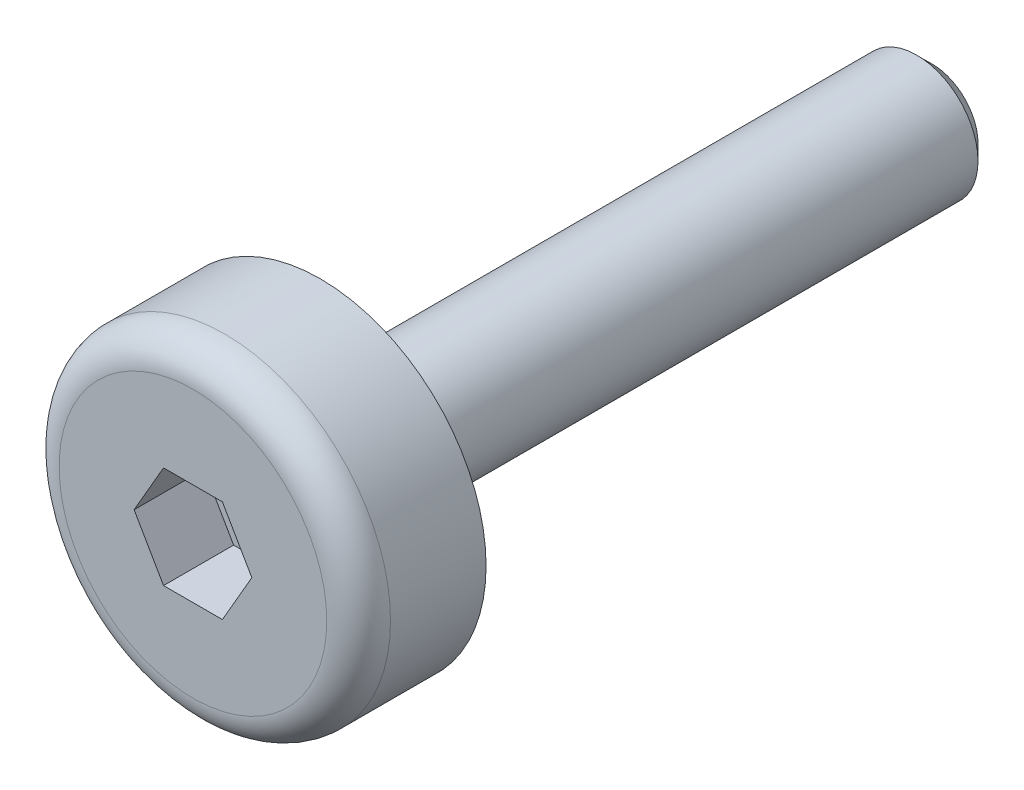
ISO-10303-21;
HEADER;
FILE_DESCRIPTION(('STEP AP214'),'2;1');
FILE_NAME('part.step','',(''),(''),'','','');
FILE_SCHEMA(('AUTOMOTIVE_DESIGN { 1 0 10303 214 1 1 1 1 }'));
ENDSEC;
DATA;
#1=APPLICATION_CONTEXT('core data for automotive mechanical design processes');
#2=APPLICATION_PROTOCOL_DEFINITION('international standard','automotive_design',2000,#1);
#3=PRODUCT_CONTEXT('',#1,'mechanical');
#4=PRODUCT('Part','Part','',(#3));
#5=PRODUCT_RELATED_PRODUCT_CATEGORY('part','',(#4));
#6=PRODUCT_DEFINITION_FORMATION('','',#4);
#7=PRODUCT_DEFINITION_CONTEXT('part definition',#1,'design');
#8=PRODUCT_DEFINITION('design','',#6,#7);
#9=PRODUCT_DEFINITION_SHAPE('','',#8);
#10=(LENGTH_UNIT() NAMED_UNIT(*) SI_UNIT(.MILLI.,.METRE.));
#11=(NAMED_UNIT(*) PLANE_ANGLE_UNIT() SI_UNIT($,.RADIAN.));
#12=(NAMED_UNIT(*) SI_UNIT($,.STERADIAN.) SOLID_ANGLE_UNIT());
#13=UNCERTAINTY_MEASURE_WITH_UNIT(LENGTH_MEASURE(1.E-05),#10,'distance_accuracy_value','');
#14=(GEOMETRIC_REPRESENTATION_CONTEXT(3) GLOBAL_UNCERTAINTY_ASSIGNED_CONTEXT((#13)) GLOBAL_UNIT_ASSIGNED_CONTEXT((#10,
#11,#12)) REPRESENTATION_CONTEXT('',''));
#15=CARTESIAN_POINT('',(0.,0.,0.));
#16=DIRECTION('',(0.,0.,1.));
#17=DIRECTION('',(1.,0.,0.));
#18=AXIS2_PLACEMENT_3D('',#15,#16,#17);
#19=CARTESIAN_POINT('',(0.,0.,-12.));
#20=DIRECTION('',(0.,0.,-1.));
#21=DIRECTION('',(-1.,0.,0.));
#22=AXIS2_PLACEMENT_3D('',#19,#20,#21);
#23=PLANE('',#22);
#24=CARTESIAN_POINT('',(0.,0.,-12.));
#25=DIRECTION('',(0.,0.,-1.));
#26=DIRECTION('',(-1.,0.,0.));
#27=AXIS2_PLACEMENT_3D('',#24,#25,#26);
#28=CIRCLE('',#27,0.899999999999995);
#29=CARTESIAN_POINT('',(0.899999999999995,0.,-12.));
#30=VERTEX_POINT('',#29);
#31=EDGE_CURVE('E156',#30,#30,#28,.T.);
#32=ORIENTED_EDGE('',*,*,#31,.T.);
#33=EDGE_LOOP('',(#32));
#34=FACE_BOUND('',#33,.T.);
#35=ADVANCED_FACE('F40',(#34),#23,.T.);
#36=CARTESIAN_POINT('',(0.,0.,10.123));
#37=DIRECTION('',(0.,0.,1.));
#38=DIRECTION('',(1.,0.,0.));
#39=AXIS2_PLACEMENT_3D('',#36,#37,#38);
#40=CYLINDRICAL_SURFACE('',#39,1.2);
#41=CARTESIAN_POINT('',(0.,0.,-11.7));
#42=DIRECTION('',(0.,0.,-1.));
#43=DIRECTION('',(-1.,0.,0.));
#44=AXIS2_PLACEMENT_3D('',#41,#42,#43);
#45=CIRCLE('',#44,1.2);
#46=CARTESIAN_POINT('',(1.2,0.,-11.7));
#47=VERTEX_POINT('',#46);
#48=EDGE_CURVE('E153',#47,#47,#45,.F.);
#49=ORIENTED_EDGE('',*,*,#48,.T.);
#50=EDGE_LOOP('',(#49));
#51=FACE_BOUND('',#50,.T.);
#52=CARTESIAN_POINT('',(0.,0.,0.));
#53=DIRECTION('',(0.,0.,1.));
#54=DIRECTION('',(1.,0.,0.));
#55=AXIS2_PLACEMENT_3D('',#52,#53,#54);
#56=CIRCLE('',#55,1.2);
#57=CARTESIAN_POINT('',(1.2,0.,0.));
#58=VERTEX_POINT('',#57);
#59=EDGE_CURVE('E150',#58,#58,#56,.T.);
#60=ORIENTED_EDGE('',*,*,#59,.F.);
#61=EDGE_LOOP('',(#60));
#62=FACE_BOUND('',#61,.T.);
#63=ADVANCED_FACE('F176',(#51,#62),#40,.T.);
#64=CARTESIAN_POINT('',(1.2,0.,0.));
#65=DIRECTION('',(0.,0.,-1.));
#66=DIRECTION('',(-1.,0.,0.));
#67=AXIS2_PLACEMENT_3D('',#64,#65,#66);
#68=PLANE('',#67);
#69=ORIENTED_EDGE('',*,*,#59,.T.);
#70=EDGE_LOOP('',(#69));
#71=FACE_BOUND('',#70,.T.);
#72=CARTESIAN_POINT('',(0.,0.,0.));
#73=DIRECTION('',(0.,0.,1.));
#74=DIRECTION('',(1.,0.,0.));
#75=AXIS2_PLACEMENT_3D('',#72,#73,#74);
#76=CIRCLE('',#75,3.25);
#77=CARTESIAN_POINT('',(3.25,0.,0.));
#78=VERTEX_POINT('',#77);
#79=EDGE_CURVE('E142',#78,#78,#76,.T.);
#80=ORIENTED_EDGE('',*,*,#79,.F.);
#81=EDGE_LOOP('',(#80));
#82=FACE_BOUND('',#81,.T.);
#83=ADVANCED_FACE('F182',(#71,#82),#68,.T.);
#84=CARTESIAN_POINT('',(0.,0.,10.123));
#85=DIRECTION('',(0.,0.,1.));
#86=DIRECTION('',(1.,0.,0.));
#87=AXIS2_PLACEMENT_3D('',#84,#85,#86);
#88=CYLINDRICAL_SURFACE('',#87,3.25);
#89=CARTESIAN_POINT('',(0.,0.,1.875));
#90=DIRECTION('',(0.,0.,1.));
#91=DIRECTION('',(1.,0.,0.));
#92=AXIS2_PLACEMENT_3D('',#89,#90,#91);
#93=CIRCLE('',#92,3.25);
#94=CARTESIAN_POINT('',(3.25,0.,1.875));
#95=VERTEX_POINT('',#94);
#96=EDGE_CURVE('E11',#95,#95,#93,.F.);
#97=ORIENTED_EDGE('',*,*,#96,.T.);
#98=EDGE_LOOP('',(#97));
#99=FACE_BOUND('',#98,.T.);
#100=ORIENTED_EDGE('',*,*,#79,.T.);
#101=EDGE_LOOP('',(#100));
#102=FACE_BOUND('',#101,.T.);
#103=ADVANCED_FACE('F191',(#99,#102),#88,.T.);
#104=CARTESIAN_POINT('',(3.25,0.,2.5));
#105=DIRECTION('',(0.,0.,1.));
#106=DIRECTION('',(1.,0.,0.));
#107=AXIS2_PLACEMENT_3D('',#104,#105,#106);
#108=PLANE('',#107);
#109=DIRECTION('',(0.499999999999995,0.866025403784441,0.));
#110=VECTOR('',#109,1.);
#111=CARTESIAN_POINT('',(0.577350269189637,-0.999999999999993,2.5));
#112=LINE('',#111,#110);
#113=CARTESIAN_POINT('',(0.577350269189637,-0.999999999999993,2.5));
#114=VERTEX_POINT('',#113);
#115=CARTESIAN_POINT('',(1.15470053837925,0.,2.5));
#116=VERTEX_POINT('',#115);
#117=EDGE_CURVE('E55',#114,#116,#112,.T.);
#118=ORIENTED_EDGE('',*,*,#117,.F.);
#119=DIRECTION('',(1.,0.,0.));
#120=VECTOR('',#119,1.);
#121=CARTESIAN_POINT('',(-0.577350269189617,-1.00000000000001,2.5));
#122=LINE('',#121,#120);
#123=CARTESIAN_POINT('',(-0.577350269189617,-1.00000000000001,2.5));
#124=VERTEX_POINT('',#123);
#125=EDGE_CURVE('E138',#124,#114,#122,.T.);
#126=ORIENTED_EDGE('',*,*,#125,.F.);
#127=DIRECTION('',(0.500000000000007,-0.866025403784434,0.));
#128=VECTOR('',#127,1.);
#129=CARTESIAN_POINT('',(-1.15470053837925,0.,2.5));
#130=LINE('',#129,#128);
#131=CARTESIAN_POINT('',(-1.15470053837925,0.,2.5));
#132=VERTEX_POINT('',#131);
#133=EDGE_CURVE('E136',#132,#124,#130,.T.);
#134=ORIENTED_EDGE('',*,*,#133,.F.);
#135=DIRECTION('',(-0.499999999999995,-0.866025403784442,0.));
#136=VECTOR('',#135,1.);
#137=CARTESIAN_POINT('',(-0.57735026918963,0.999999999999998,2.5));
#138=LINE('',#137,#136);
#139=CARTESIAN_POINT('',(-0.57735026918963,0.999999999999998,2.5));
#140=VERTEX_POINT('',#139);
#141=EDGE_CURVE('E103',#140,#132,#138,.T.);
#142=ORIENTED_EDGE('',*,*,#141,.F.);
#143=DIRECTION('',(-1.,0.,0.));
#144=VECTOR('',#143,1.);
#145=CARTESIAN_POINT('',(0.577350269189624,1.,2.5));
#146=LINE('',#145,#144);
#147=CARTESIAN_POINT('',(0.577350269189624,1.,2.5));
#148=VERTEX_POINT('',#147);
#149=EDGE_CURVE('E132',#148,#140,#146,.T.);
#150=ORIENTED_EDGE('',*,*,#149,.F.);
#151=DIRECTION('',(-0.500000000000001,0.866025403784438,0.));
#152=VECTOR('',#151,1.);
#153=CARTESIAN_POINT('',(1.15470053837925,0.,2.5));
#154=LINE('',#153,#152);
#155=EDGE_CURVE('E129',#116,#148,#154,.T.);
#156=ORIENTED_EDGE('',*,*,#155,.F.);
#157=EDGE_LOOP('',(#118,#126,#134,#142,#150,#156));
#158=FACE_BOUND('',#157,.T.);
#159=CARTESIAN_POINT('',(0.,0.,2.5));
#160=DIRECTION('',(0.,0.,1.));
#161=DIRECTION('',(1.,0.,0.));
#162=AXIS2_PLACEMENT_3D('',#159,#160,#161);
#163=CIRCLE('',#162,2.625);
#164=CARTESIAN_POINT('',(2.625,0.,2.5));
#165=VERTEX_POINT('',#164);
#166=EDGE_CURVE('E48',#165,#165,#163,.T.);
#167=ORIENTED_EDGE('',*,*,#166,.T.);
#168=EDGE_LOOP('',(#167));
#169=FACE_BOUND('',#168,.T.);
#170=ADVANCED_FACE('F161',(#158,#169),#108,.T.);
#171=CARTESIAN_POINT('',(0.,0.,-11.7));
#172=DIRECTION('',(0.,0.,1.));
#173=DIRECTION('',(1.,0.,0.));
#174=AXIS2_PLACEMENT_3D('',#171,#172,#173);
#175=CONICAL_SURFACE('',#174,1.2,0.785398163397449);
#176=CARTESIAN_POINT('',(0.899999999999995,0.,-12.));
#177=CARTESIAN_POINT('',(0.903124999999996,0.,-11.996875));
#178=CARTESIAN_POINT('',(0.906249999999996,0.,-11.99375));
#179=CARTESIAN_POINT('',(0.912499999999996,0.,-11.9875));
#180=CARTESIAN_POINT('',(0.915624999999996,0.,-11.984375));
#181=CARTESIAN_POINT('',(0.921874999999996,0.,-11.978125));
#182=CARTESIAN_POINT('',(0.924999999999996,0.,-11.975));
#183=CARTESIAN_POINT('',(0.931249999999996,0.,-11.96875));
#184=CARTESIAN_POINT('',(0.934374999999996,0.,-11.965625));
#185=CARTESIAN_POINT('',(0.940624999999996,0.,-11.959375));
#186=CARTESIAN_POINT('',(0.943749999999996,0.,-11.95625));
#187=CARTESIAN_POINT('',(0.949999999999996,0.,-11.95));
#188=CARTESIAN_POINT('',(0.953124999999996,0.,-11.946875));
#189=CARTESIAN_POINT('',(0.959374999999996,0.,-11.940625));
#190=CARTESIAN_POINT('',(0.962499999999997,0.,-11.9375));
#191=CARTESIAN_POINT('',(0.968749999999997,0.,-11.93125));
#192=CARTESIAN_POINT('',(0.971874999999997,0.,-11.928125));
#193=CARTESIAN_POINT('',(0.978124999999997,0.,-11.921875));
#194=CARTESIAN_POINT('',(0.981249999999997,0.,-11.91875));
#195=CARTESIAN_POINT('',(0.987499999999997,0.,-11.9125));
#196=CARTESIAN_POINT('',(0.990624999999997,0.,-11.909375));
#197=CARTESIAN_POINT('',(0.996874999999997,0.,-11.903125));
#198=CARTESIAN_POINT('',(0.999999999999997,0.,-11.9));
#199=CARTESIAN_POINT('',(1.00625,0.,-11.89375));
#200=CARTESIAN_POINT('',(1.009375,0.,-11.890625));
#201=CARTESIAN_POINT('',(1.015625,0.,-11.884375));
#202=CARTESIAN_POINT('',(1.01875,0.,-11.88125));
#203=CARTESIAN_POINT('',(1.025,0.,-11.875));
#204=CARTESIAN_POINT('',(1.028125,0.,-11.871875));
#205=CARTESIAN_POINT('',(1.034375,0.,-11.865625));
#206=CARTESIAN_POINT('',(1.0375,0.,-11.8625));
#207=CARTESIAN_POINT('',(1.04375,0.,-11.85625));
#208=CARTESIAN_POINT('',(1.046875,0.,-11.853125));
#209=CARTESIAN_POINT('',(1.053125,0.,-11.846875));
#210=CARTESIAN_POINT('',(1.05625,0.,-11.84375));
#211=CARTESIAN_POINT('',(1.0625,0.,-11.8375));
#212=CARTESIAN_POINT('',(1.065625,0.,-11.834375));
#213=CARTESIAN_POINT('',(1.071875,0.,-11.828125));
#214=CARTESIAN_POINT('',(1.075,0.,-11.825));
#215=CARTESIAN_POINT('',(1.08125,0.,-11.81875));
#216=CARTESIAN_POINT('',(1.084375,0.,-11.815625));
#217=CARTESIAN_POINT('',(1.090625,0.,-11.809375));
#218=CARTESIAN_POINT('',(1.09375,0.,-11.80625));
#219=CARTESIAN_POINT('',(1.1,0.,-11.8));
#220=CARTESIAN_POINT('',(1.103125,0.,-11.796875));
#221=CARTESIAN_POINT('',(1.109375,0.,-11.790625));
#222=CARTESIAN_POINT('',(1.1125,0.,-11.7875));
#223=CARTESIAN_POINT('',(1.11875,0.,-11.78125));
#224=CARTESIAN_POINT('',(1.121875,0.,-11.778125));
#225=CARTESIAN_POINT('',(1.128125,0.,-11.771875));
#226=CARTESIAN_POINT('',(1.13125,0.,-11.76875));
#227=CARTESIAN_POINT('',(1.1375,0.,-11.7625));
#228=CARTESIAN_POINT('',(1.140625,0.,-11.759375));
#229=CARTESIAN_POINT('',(1.146875,0.,-11.753125));
#230=CARTESIAN_POINT('',(1.15,0.,-11.75));
#231=CARTESIAN_POINT('',(1.15625,0.,-11.74375));
#232=CARTESIAN_POINT('',(1.159375,0.,-11.740625));
#233=CARTESIAN_POINT('',(1.165625,0.,-11.734375));
#234=CARTESIAN_POINT('',(1.16875,0.,-11.73125));
#235=CARTESIAN_POINT('',(1.175,0.,-11.725));
#236=CARTESIAN_POINT('',(1.178125,0.,-11.721875));
#237=CARTESIAN_POINT('',(1.184375,0.,-11.715625));
#238=CARTESIAN_POINT('',(1.1875,0.,-11.7125));
#239=CARTESIAN_POINT('',(1.19375,0.,-11.70625));
#240=CARTESIAN_POINT('',(1.196875,0.,-11.703125));
#241=CARTESIAN_POINT('',(1.2,0.,-11.7));
#242=B_SPLINE_CURVE_WITH_KNOTS('',3,(#176,#177,#178,#179,#180,#181,#182,#183,#184,#185,#186,
#187,#188,#189,#190,#191,#192,#193,#194,#195,#196,#197,#198,#199,#200,#201,#202,#203,#204,#205,
#206,#207,#208,#209,#210,#211,#212,#213,#214,#215,#216,#217,#218,#219,#220,#221,#222,#223,#224,
#225,#226,#227,#228,#229,#230,#231,#232,#233,#234,#235,#236,#237,#238,#239,#240,#241),
.UNSPECIFIED.,.F.,.F.,(4,2,2,2,2,2,2,2,2,2,2,2,2,2,2,2,2,2,2,2,2,2,2,2,2,2,2,2,2,2,2,2,4),(0.,
0.0132582521472471,0.0265165042944955,0.0397747564417439,0.053033008588991,0.0662912607362394,
0.0795495128834878,0.092807765030735,0.106066017177983,0.119324269325232,0.132582521472479,
0.145840773619727,0.159099025766976,0.172357277914223,0.185615530061471,0.19887378220872,
0.212132034355968,0.225390286503215,0.238648538650464,0.251906790797712,0.265165042944959,
0.278423295092207,0.291681547239456,0.304939799386703,0.318198051533951,0.3314563036812,
0.344714555828447,0.357972807975695,0.371231060122944,0.384489312270191,0.397747564417439,
0.411005816564687,0.424264068711935),.UNSPECIFIED.);
#243=EDGE_CURVE('BSEAM165',#30,#47,#242,.T.);
#244=ORIENTED_EDGE('',*,*,#31,.F.);
#245=ORIENTED_EDGE('',*,*,#48,.F.);
#246=ORIENTED_EDGE('',*,*,#243,.T.);
#247=ORIENTED_EDGE('',*,*,#243,.F.);
#248=EDGE_LOOP('',(#244,#246,#245,#247));
#249=FACE_BOUND('',#248,.T.);
#250=ADVANCED_FACE('F165',(#249),#175,.T.);
#251=CARTESIAN_POINT('',(0.,0.,1.875));
#252=DIRECTION('',(0.,0.,1.));
#253=DIRECTION('',(1.,0.,0.));
#254=AXIS2_PLACEMENT_3D('',#251,#252,#253);
#255=TOROIDAL_SURFACE('',#254,2.625,0.625);
#256=ORIENTED_EDGE('',*,*,#96,.F.);
#257=EDGE_LOOP('',(#256));
#258=FACE_BOUND('',#257,.T.);
#259=ORIENTED_EDGE('',*,*,#166,.F.);
#260=EDGE_LOOP('',(#259));
#261=FACE_BOUND('',#260,.T.);
#262=ADVANCED_FACE('F42',(#258,#261),#255,.T.);
#263=CARTESIAN_POINT('',(0.577350269189637,-0.999999999999993,1.125));
#264=DIRECTION('',(0.866025403784441,-0.499999999999995,0.));
#265=DIRECTION('',(0.499999999999995,0.866025403784441,0.));
#266=AXIS2_PLACEMENT_3D('',#263,#264,#265);
#267=PLANE('',#266);
#268=ORIENTED_EDGE('',*,*,#117,.T.);
#269=DIRECTION('',(0.,0.,1.));
#270=VECTOR('',#269,1.);
#271=CARTESIAN_POINT('',(1.15470053837925,0.,1.125));
#272=LINE('',#271,#270);
#273=CARTESIAN_POINT('',(1.15470053837925,0.,1.125));
#274=VERTEX_POINT('',#273);
#275=EDGE_CURVE('E85',#274,#116,#272,.T.);
#276=ORIENTED_EDGE('',*,*,#275,.F.);
#277=DIRECTION('',(0.499999999999995,0.866025403784441,0.));
#278=VECTOR('',#277,1.);
#279=CARTESIAN_POINT('',(0.577350269189637,-0.999999999999993,1.125));
#280=LINE('',#279,#278);
#281=CARTESIAN_POINT('',(0.577350269189637,-0.999999999999993,1.125));
#282=VERTEX_POINT('',#281);
#283=EDGE_CURVE('E140',#282,#274,#280,.T.);
#284=ORIENTED_EDGE('',*,*,#283,.F.);
#285=DIRECTION('',(0.,0.,1.));
#286=VECTOR('',#285,1.);
#287=CARTESIAN_POINT('',(0.577350269189637,-0.999999999999993,1.125));
#288=LINE('',#287,#286);
#289=EDGE_CURVE('E63',#282,#114,#288,.T.);
#290=ORIENTED_EDGE('',*,*,#289,.T.);
#291=EDGE_LOOP('',(#268,#276,#284,#290));
#292=FACE_BOUND('',#291,.T.);
#293=ADVANCED_FACE('F164',(#292),#267,.F.);
#294=CARTESIAN_POINT('',(-0.577350269189617,-1.00000000000001,1.125));
#295=DIRECTION('',(0.,-1.,0.));
#296=DIRECTION('',(1.,0.,0.));
#297=AXIS2_PLACEMENT_3D('',#294,#295,#296);
#298=PLANE('',#297);
#299=ORIENTED_EDGE('',*,*,#125,.T.);
#300=ORIENTED_EDGE('',*,*,#289,.F.);
#301=DIRECTION('',(1.,0.,0.));
#302=VECTOR('',#301,1.);
#303=CARTESIAN_POINT('',(-0.577350269189617,-1.00000000000001,1.125));
#304=LINE('',#303,#302);
#305=CARTESIAN_POINT('',(-0.577350269189617,-1.00000000000001,1.125));
#306=VERTEX_POINT('',#305);
#307=EDGE_CURVE('E115',#306,#282,#304,.T.);
#308=ORIENTED_EDGE('',*,*,#307,.F.);
#309=DIRECTION('',(0.,0.,1.));
#310=VECTOR('',#309,1.);
#311=CARTESIAN_POINT('',(-0.577350269189617,-1.00000000000001,1.125));
#312=LINE('',#311,#310);
#313=EDGE_CURVE('E107',#306,#124,#312,.T.);
#314=ORIENTED_EDGE('',*,*,#313,.T.);
#315=EDGE_LOOP('',(#299,#300,#308,#314));
#316=FACE_BOUND('',#315,.T.);
#317=ADVANCED_FACE('F171',(#316),#298,.F.);
#318=CARTESIAN_POINT('',(-1.15470053837925,0.,1.125));
#319=DIRECTION('',(-0.866025403784435,-0.500000000000007,0.));
#320=DIRECTION('',(0.500000000000007,-0.866025403784435,0.));
#321=AXIS2_PLACEMENT_3D('',#318,#319,#320);
#322=PLANE('',#321);
#323=ORIENTED_EDGE('',*,*,#133,.T.);
#324=ORIENTED_EDGE('',*,*,#313,.F.);
#325=DIRECTION('',(0.500000000000007,-0.866025403784434,0.));
#326=VECTOR('',#325,1.);
#327=CARTESIAN_POINT('',(-1.15470053837925,0.,1.125));
#328=LINE('',#327,#326);
#329=CARTESIAN_POINT('',(-1.15470053837925,0.,1.125));
#330=VERTEX_POINT('',#329);
#331=EDGE_CURVE('E111',#330,#306,#328,.T.);
#332=ORIENTED_EDGE('',*,*,#331,.F.);
#333=DIRECTION('',(0.,0.,1.));
#334=VECTOR('',#333,1.);
#335=CARTESIAN_POINT('',(-1.15470053837925,0.,1.125));
#336=LINE('',#335,#334);
#337=EDGE_CURVE('E96',#330,#132,#336,.T.);
#338=ORIENTED_EDGE('',*,*,#337,.T.);
#339=EDGE_LOOP('',(#323,#324,#332,#338));
#340=FACE_BOUND('',#339,.T.);
#341=ADVANCED_FACE('F112',(#340),#322,.F.);
#342=CARTESIAN_POINT('',(-0.57735026918963,0.999999999999998,1.125));
#343=DIRECTION('',(-0.866025403784442,0.499999999999995,0.));
#344=DIRECTION('',(-0.499999999999995,-0.866025403784441,0.));
#345=AXIS2_PLACEMENT_3D('',#342,#343,#344);
#346=PLANE('',#345);
#347=ORIENTED_EDGE('',*,*,#141,.T.);
#348=ORIENTED_EDGE('',*,*,#337,.F.);
#349=DIRECTION('',(-0.499999999999995,-0.866025403784442,0.));
#350=VECTOR('',#349,1.);
#351=CARTESIAN_POINT('',(-0.57735026918963,0.999999999999998,1.125));
#352=LINE('',#351,#350);
#353=CARTESIAN_POINT('',(-0.57735026918963,0.999999999999998,1.125));
#354=VERTEX_POINT('',#353);
#355=EDGE_CURVE('E100',#354,#330,#352,.T.);
#356=ORIENTED_EDGE('',*,*,#355,.F.);
#357=DIRECTION('',(0.,0.,1.));
#358=VECTOR('',#357,1.);
#359=CARTESIAN_POINT('',(-0.57735026918963,0.999999999999998,1.125));
#360=LINE('',#359,#358);
#361=EDGE_CURVE('E108',#354,#140,#360,.T.);
#362=ORIENTED_EDGE('',*,*,#361,.T.);
#363=EDGE_LOOP('',(#347,#348,#356,#362));
#364=FACE_BOUND('',#363,.T.);
#365=ADVANCED_FACE('F98',(#364),#346,.F.);
#366=CARTESIAN_POINT('',(0.577350269189624,1.,1.125));
#367=DIRECTION('',(0.,1.,0.));
#368=DIRECTION('',(-1.,0.,0.));
#369=AXIS2_PLACEMENT_3D('',#366,#367,#368);
#370=PLANE('',#369);
#371=ORIENTED_EDGE('',*,*,#149,.T.);
#372=ORIENTED_EDGE('',*,*,#361,.F.);
#373=DIRECTION('',(-1.,0.,0.));
#374=VECTOR('',#373,1.);
#375=CARTESIAN_POINT('',(0.577350269189624,1.,1.125));
#376=LINE('',#375,#374);
#377=CARTESIAN_POINT('',(0.577350269189624,1.,1.125));
#378=VERTEX_POINT('',#377);
#379=EDGE_CURVE('E121',#378,#354,#376,.T.);
#380=ORIENTED_EDGE('',*,*,#379,.F.);
#381=DIRECTION('',(0.,0.,1.));
#382=VECTOR('',#381,1.);
#383=CARTESIAN_POINT('',(0.577350269189624,1.,1.125));
#384=LINE('',#383,#382);
#385=EDGE_CURVE('E145',#378,#148,#384,.T.);
#386=ORIENTED_EDGE('',*,*,#385,.T.);
#387=EDGE_LOOP('',(#371,#372,#380,#386));
#388=FACE_BOUND('',#387,.T.);
#389=ADVANCED_FACE('F202',(#388),#370,.F.);
#390=CARTESIAN_POINT('',(1.15470053837925,0.,1.125));
#391=DIRECTION('',(0.866025403784438,0.500000000000001,0.));
#392=DIRECTION('',(-0.500000000000001,0.866025403784438,0.));
#393=AXIS2_PLACEMENT_3D('',#390,#391,#392);
#394=PLANE('',#393);
#395=ORIENTED_EDGE('',*,*,#155,.T.);
#396=ORIENTED_EDGE('',*,*,#385,.F.);
#397=DIRECTION('',(-0.500000000000001,0.866025403784438,0.));
#398=VECTOR('',#397,1.);
#399=CARTESIAN_POINT('',(1.15470053837925,0.,1.125));
#400=LINE('',#399,#398);
#401=EDGE_CURVE('E123',#274,#378,#400,.T.);
#402=ORIENTED_EDGE('',*,*,#401,.F.);
#403=ORIENTED_EDGE('',*,*,#275,.T.);
#404=EDGE_LOOP('',(#395,#396,#402,#403));
#405=FACE_BOUND('',#404,.T.);
#406=ADVANCED_FACE('F199',(#405),#394,.F.);
#407=CARTESIAN_POINT('',(0.,0.,1.125));
#408=DIRECTION('',(0.,0.,1.));
#409=DIRECTION('',(1.,0.,0.));
#410=AXIS2_PLACEMENT_3D('',#407,#408,#409);
#411=PLANE('',#410);
#412=ORIENTED_EDGE('',*,*,#283,.T.);
#413=ORIENTED_EDGE('',*,*,#401,.T.);
#414=ORIENTED_EDGE('',*,*,#379,.T.);
#415=ORIENTED_EDGE('',*,*,#355,.T.);
#416=ORIENTED_EDGE('',*,*,#331,.T.);
#417=ORIENTED_EDGE('',*,*,#307,.T.);
#418=EDGE_LOOP('',(#412,#413,#414,#415,#416,#417));
#419=FACE_BOUND('',#418,.T.);
#420=ADVANCED_FACE('F118',(#419),#411,.T.);
#421=CLOSED_SHELL('',(#35,#63,#83,#103,#170,#250,#262,#293,#317,#341,#365,#389,#406,#420));
#422=MANIFOLD_SOLID_BREP('B2',#421);
#423=ADVANCED_BREP_SHAPE_REPRESENTATION('',(#18,#422),#14);
#424=SHAPE_DEFINITION_REPRESENTATION(#9,#423);
ENDSEC;
END-ISO-10303-21;
